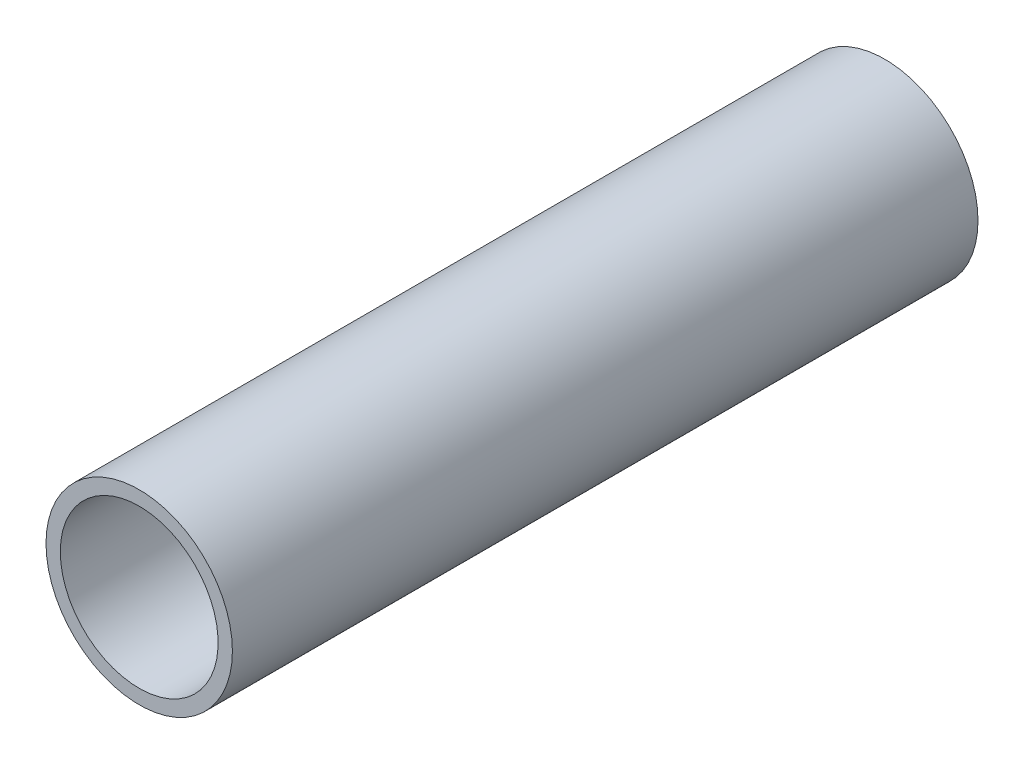
ISO-10303-21;
HEADER;
FILE_DESCRIPTION(('STEP AP214'),'2;1');
FILE_NAME('part.step','',(''),(''),'','','');
FILE_SCHEMA(('AUTOMOTIVE_DESIGN { 1 0 10303 214 1 1 1 1 }'));
ENDSEC;
DATA;
#1=APPLICATION_CONTEXT('core data for automotive mechanical design processes');
#2=APPLICATION_PROTOCOL_DEFINITION('international standard','automotive_design',2000,#1);
#3=PRODUCT_CONTEXT('',#1,'mechanical');
#4=PRODUCT('Part','Part','',(#3));
#5=PRODUCT_RELATED_PRODUCT_CATEGORY('part','',(#4));
#6=PRODUCT_DEFINITION_FORMATION('','',#4);
#7=PRODUCT_DEFINITION_CONTEXT('part definition',#1,'design');
#8=PRODUCT_DEFINITION('design','',#6,#7);
#9=PRODUCT_DEFINITION_SHAPE('','',#8);
#10=(LENGTH_UNIT() NAMED_UNIT(*) SI_UNIT(.MILLI.,.METRE.));
#11=(NAMED_UNIT(*) PLANE_ANGLE_UNIT() SI_UNIT($,.RADIAN.));
#12=(NAMED_UNIT(*) SI_UNIT($,.STERADIAN.) SOLID_ANGLE_UNIT());
#13=UNCERTAINTY_MEASURE_WITH_UNIT(LENGTH_MEASURE(1.E-05),#10,'distance_accuracy_value','');
#14=(GEOMETRIC_REPRESENTATION_CONTEXT(3) GLOBAL_UNCERTAINTY_ASSIGNED_CONTEXT((#13)) GLOBAL_UNIT_ASSIGNED_CONTEXT((#10,
#11,#12)) REPRESENTATION_CONTEXT('',''));
#15=CARTESIAN_POINT('',(0.,0.,0.));
#16=DIRECTION('',(0.,0.,1.));
#17=DIRECTION('',(1.,0.,0.));
#18=AXIS2_PLACEMENT_3D('',#15,#16,#17);
#19=CARTESIAN_POINT('',(0.,0.,152.4));
#20=DIRECTION('',(0.,0.,1.));
#21=DIRECTION('',(1.,0.,0.));
#22=AXIS2_PLACEMENT_3D('',#19,#20,#21);
#23=PLANE('',#22);
#24=CARTESIAN_POINT('',(0.,0.,152.4));
#25=DIRECTION('',(0.,0.,1.));
#26=DIRECTION('',(1.,0.,0.));
#27=AXIS2_PLACEMENT_3D('',#24,#25,#26);
#28=CIRCLE('',#27,19.05);
#29=CARTESIAN_POINT('',(-19.05,0.,152.4));
#30=VERTEX_POINT('',#29);
#31=EDGE_CURVE('E10',#30,#30,#28,.T.);
#32=ORIENTED_EDGE('',*,*,#31,.T.);
#33=EDGE_LOOP('',(#32));
#34=FACE_BOUND('',#33,.T.);
#35=CARTESIAN_POINT('',(0.,0.,152.4));
#36=DIRECTION('',(0.,0.,1.));
#37=DIRECTION('',(1.,0.,0.));
#38=AXIS2_PLACEMENT_3D('',#35,#36,#37);
#39=CIRCLE('',#38,16.129);
#40=CARTESIAN_POINT('',(-16.129,0.,152.4));
#41=VERTEX_POINT('',#40);
#42=EDGE_CURVE('E49',#41,#41,#39,.T.);
#43=ORIENTED_EDGE('',*,*,#42,.F.);
#44=EDGE_LOOP('',(#43));
#45=FACE_BOUND('',#44,.T.);
#46=ADVANCED_FACE('F35',(#34,#45),#23,.T.);
#47=CARTESIAN_POINT('',(0.,0.,0.));
#48=DIRECTION('',(0.,0.,1.));
#49=DIRECTION('',(1.,0.,0.));
#50=AXIS2_PLACEMENT_3D('',#47,#48,#49);
#51=PLANE('',#50);
#52=CARTESIAN_POINT('',(0.,0.,0.));
#53=DIRECTION('',(0.,0.,1.));
#54=DIRECTION('',(1.,0.,0.));
#55=AXIS2_PLACEMENT_3D('',#52,#53,#54);
#56=CIRCLE('',#55,19.05);
#57=CARTESIAN_POINT('',(-19.05,0.,0.));
#58=VERTEX_POINT('',#57);
#59=EDGE_CURVE('E39',#58,#58,#56,.T.);
#60=ORIENTED_EDGE('',*,*,#59,.F.);
#61=EDGE_LOOP('',(#60));
#62=FACE_BOUND('',#61,.T.);
#63=CARTESIAN_POINT('',(0.,0.,0.));
#64=DIRECTION('',(0.,0.,1.));
#65=DIRECTION('',(1.,0.,0.));
#66=AXIS2_PLACEMENT_3D('',#63,#64,#65);
#67=CIRCLE('',#66,16.129);
#68=CARTESIAN_POINT('',(-16.129,0.,0.));
#69=VERTEX_POINT('',#68);
#70=EDGE_CURVE('E51',#69,#69,#67,.T.);
#71=ORIENTED_EDGE('',*,*,#70,.T.);
#72=EDGE_LOOP('',(#71));
#73=FACE_BOUND('',#72,.T.);
#74=ADVANCED_FACE('F62',(#62,#73),#51,.F.);
#75=CARTESIAN_POINT('',(0.,0.,152.4));
#76=DIRECTION('',(0.,0.,-1.));
#77=DIRECTION('',(-1.,0.,0.));
#78=AXIS2_PLACEMENT_3D('',#75,#76,#77);
#79=CYLINDRICAL_SURFACE('',#78,19.05);
#80=CARTESIAN_POINT('',(-19.05,0.,152.4));
#81=CARTESIAN_POINT('',(-19.05,0.,150.8125));
#82=CARTESIAN_POINT('',(-19.05,0.,149.225));
#83=CARTESIAN_POINT('',(-19.05,0.,146.05));
#84=CARTESIAN_POINT('',(-19.05,0.,144.4625));
#85=CARTESIAN_POINT('',(-19.05,0.,141.2875));
#86=CARTESIAN_POINT('',(-19.05,0.,139.7));
#87=CARTESIAN_POINT('',(-19.05,0.,136.525));
#88=CARTESIAN_POINT('',(-19.05,0.,134.9375));
#89=CARTESIAN_POINT('',(-19.05,0.,131.7625));
#90=CARTESIAN_POINT('',(-19.05,0.,130.175));
#91=CARTESIAN_POINT('',(-19.05,0.,127.));
#92=CARTESIAN_POINT('',(-19.05,0.,125.4125));
#93=CARTESIAN_POINT('',(-19.05,0.,122.2375));
#94=CARTESIAN_POINT('',(-19.05,0.,120.65));
#95=CARTESIAN_POINT('',(-19.05,0.,117.475));
#96=CARTESIAN_POINT('',(-19.05,0.,115.8875));
#97=CARTESIAN_POINT('',(-19.05,0.,112.7125));
#98=CARTESIAN_POINT('',(-19.05,0.,111.125));
#99=CARTESIAN_POINT('',(-19.05,0.,107.95));
#100=CARTESIAN_POINT('',(-19.05,0.,106.3625));
#101=CARTESIAN_POINT('',(-19.05,0.,103.1875));
#102=CARTESIAN_POINT('',(-19.05,0.,101.6));
#103=CARTESIAN_POINT('',(-19.05,0.,98.425));
#104=CARTESIAN_POINT('',(-19.05,0.,96.8375));
#105=CARTESIAN_POINT('',(-19.05,0.,93.6625));
#106=CARTESIAN_POINT('',(-19.05,0.,92.075));
#107=CARTESIAN_POINT('',(-19.05,0.,88.9));
#108=CARTESIAN_POINT('',(-19.05,0.,87.3125));
#109=CARTESIAN_POINT('',(-19.05,0.,84.1375));
#110=CARTESIAN_POINT('',(-19.05,0.,82.55));
#111=CARTESIAN_POINT('',(-19.05,0.,79.375));
#112=CARTESIAN_POINT('',(-19.05,0.,77.7875));
#113=CARTESIAN_POINT('',(-19.05,0.,74.6125));
#114=CARTESIAN_POINT('',(-19.05,0.,73.025));
#115=CARTESIAN_POINT('',(-19.05,0.,69.85));
#116=CARTESIAN_POINT('',(-19.05,0.,68.2625));
#117=CARTESIAN_POINT('',(-19.05,0.,65.0875));
#118=CARTESIAN_POINT('',(-19.05,0.,63.5));
#119=CARTESIAN_POINT('',(-19.05,0.,60.325));
#120=CARTESIAN_POINT('',(-19.05,0.,58.7375));
#121=CARTESIAN_POINT('',(-19.05,0.,55.5625));
#122=CARTESIAN_POINT('',(-19.05,0.,53.975));
#123=CARTESIAN_POINT('',(-19.05,0.,50.8));
#124=CARTESIAN_POINT('',(-19.05,0.,49.2125));
#125=CARTESIAN_POINT('',(-19.05,0.,46.0375));
#126=CARTESIAN_POINT('',(-19.05,0.,44.45));
#127=CARTESIAN_POINT('',(-19.05,0.,41.275));
#128=CARTESIAN_POINT('',(-19.05,0.,39.6875));
#129=CARTESIAN_POINT('',(-19.05,0.,36.5125));
#130=CARTESIAN_POINT('',(-19.05,0.,34.925));
#131=CARTESIAN_POINT('',(-19.05,0.,31.75));
#132=CARTESIAN_POINT('',(-19.05,0.,30.1625));
#133=CARTESIAN_POINT('',(-19.05,0.,26.9875));
#134=CARTESIAN_POINT('',(-19.05,0.,25.4));
#135=CARTESIAN_POINT('',(-19.05,0.,22.225));
#136=CARTESIAN_POINT('',(-19.05,0.,20.6375));
#137=CARTESIAN_POINT('',(-19.05,0.,17.4625));
#138=CARTESIAN_POINT('',(-19.05,0.,15.875));
#139=CARTESIAN_POINT('',(-19.05,0.,12.7));
#140=CARTESIAN_POINT('',(-19.05,0.,11.1125));
#141=CARTESIAN_POINT('',(-19.05,0.,7.93750000000001));
#142=CARTESIAN_POINT('',(-19.05,0.,6.35));
#143=CARTESIAN_POINT('',(-19.05,0.,3.175));
#144=CARTESIAN_POINT('',(-19.05,0.,1.5875));
#145=CARTESIAN_POINT('',(-19.05,0.,0.));
#146=B_SPLINE_CURVE_WITH_KNOTS('',3,(#80,#81,#82,#83,#84,#85,#86,#87,#88,#89,#90,#91,#92,#93,
#94,#95,#96,#97,#98,#99,#100,#101,#102,#103,#104,#105,#106,#107,#108,#109,#110,#111,#112,#113,
#114,#115,#116,#117,#118,#119,#120,#121,#122,#123,#124,#125,#126,#127,#128,#129,#130,#131,#132,
#133,#134,#135,#136,#137,#138,#139,#140,#141,#142,#143,#144,#145),.UNSPECIFIED.,.F.,.F.,(4,2,2,
2,2,2,2,2,2,2,2,2,2,2,2,2,2,2,2,2,2,2,2,2,2,2,2,2,2,2,2,2,4),(0.,4.7625,9.52500000000001,
14.2875,19.05,23.8125,28.575,33.3375,38.1,42.8625,47.625,52.3875,57.15,61.9125,66.675,71.4375,
76.2,80.9625,85.725,90.4875,95.25,100.0125,104.775,109.5375,114.3,119.0625,123.825,128.5875,
133.35,138.1125,142.875,147.6375,152.4),.UNSPECIFIED.);
#147=EDGE_CURVE('BSEAM37',#30,#58,#146,.T.);
#148=ORIENTED_EDGE('',*,*,#31,.F.);
#149=ORIENTED_EDGE('',*,*,#59,.T.);
#150=ORIENTED_EDGE('',*,*,#147,.T.);
#151=ORIENTED_EDGE('',*,*,#147,.F.);
#152=EDGE_LOOP('',(#148,#150,#149,#151));
#153=FACE_BOUND('',#152,.T.);
#154=ADVANCED_FACE('F37',(#153),#79,.T.);
#155=CARTESIAN_POINT('',(0.,0.,152.4));
#156=DIRECTION('',(0.,0.,-1.));
#157=DIRECTION('',(-1.,0.,0.));
#158=AXIS2_PLACEMENT_3D('',#155,#156,#157);
#159=CYLINDRICAL_SURFACE('',#158,16.129);
#160=CARTESIAN_POINT('',(-16.129,0.,152.4));
#161=CARTESIAN_POINT('',(-16.129,0.,150.8125));
#162=CARTESIAN_POINT('',(-16.129,0.,149.225));
#163=CARTESIAN_POINT('',(-16.129,0.,146.05));
#164=CARTESIAN_POINT('',(-16.129,0.,144.4625));
#165=CARTESIAN_POINT('',(-16.129,0.,141.2875));
#166=CARTESIAN_POINT('',(-16.129,0.,139.7));
#167=CARTESIAN_POINT('',(-16.129,0.,136.525));
#168=CARTESIAN_POINT('',(-16.129,0.,134.9375));
#169=CARTESIAN_POINT('',(-16.129,0.,131.7625));
#170=CARTESIAN_POINT('',(-16.129,0.,130.175));
#171=CARTESIAN_POINT('',(-16.129,0.,127.));
#172=CARTESIAN_POINT('',(-16.129,0.,125.4125));
#173=CARTESIAN_POINT('',(-16.129,0.,122.2375));
#174=CARTESIAN_POINT('',(-16.129,0.,120.65));
#175=CARTESIAN_POINT('',(-16.129,0.,117.475));
#176=CARTESIAN_POINT('',(-16.129,0.,115.8875));
#177=CARTESIAN_POINT('',(-16.129,0.,112.7125));
#178=CARTESIAN_POINT('',(-16.129,0.,111.125));
#179=CARTESIAN_POINT('',(-16.129,0.,107.95));
#180=CARTESIAN_POINT('',(-16.129,0.,106.3625));
#181=CARTESIAN_POINT('',(-16.129,0.,103.1875));
#182=CARTESIAN_POINT('',(-16.129,0.,101.6));
#183=CARTESIAN_POINT('',(-16.129,0.,98.425));
#184=CARTESIAN_POINT('',(-16.129,0.,96.8375));
#185=CARTESIAN_POINT('',(-16.129,0.,93.6625));
#186=CARTESIAN_POINT('',(-16.129,0.,92.075));
#187=CARTESIAN_POINT('',(-16.129,0.,88.9));
#188=CARTESIAN_POINT('',(-16.129,0.,87.3125));
#189=CARTESIAN_POINT('',(-16.129,0.,84.1375));
#190=CARTESIAN_POINT('',(-16.129,0.,82.55));
#191=CARTESIAN_POINT('',(-16.129,0.,79.375));
#192=CARTESIAN_POINT('',(-16.129,0.,77.7875));
#193=CARTESIAN_POINT('',(-16.129,0.,74.6125));
#194=CARTESIAN_POINT('',(-16.129,0.,73.025));
#195=CARTESIAN_POINT('',(-16.129,0.,69.85));
#196=CARTESIAN_POINT('',(-16.129,0.,68.2625));
#197=CARTESIAN_POINT('',(-16.129,0.,65.0875));
#198=CARTESIAN_POINT('',(-16.129,0.,63.5));
#199=CARTESIAN_POINT('',(-16.129,0.,60.325));
#200=CARTESIAN_POINT('',(-16.129,0.,58.7375));
#201=CARTESIAN_POINT('',(-16.129,0.,55.5625));
#202=CARTESIAN_POINT('',(-16.129,0.,53.975));
#203=CARTESIAN_POINT('',(-16.129,0.,50.8));
#204=CARTESIAN_POINT('',(-16.129,0.,49.2125));
#205=CARTESIAN_POINT('',(-16.129,0.,46.0375));
#206=CARTESIAN_POINT('',(-16.129,0.,44.45));
#207=CARTESIAN_POINT('',(-16.129,0.,41.275));
#208=CARTESIAN_POINT('',(-16.129,0.,39.6875));
#209=CARTESIAN_POINT('',(-16.129,0.,36.5125));
#210=CARTESIAN_POINT('',(-16.129,0.,34.925));
#211=CARTESIAN_POINT('',(-16.129,0.,31.75));
#212=CARTESIAN_POINT('',(-16.129,0.,30.1625));
#213=CARTESIAN_POINT('',(-16.129,0.,26.9875));
#214=CARTESIAN_POINT('',(-16.129,0.,25.4));
#215=CARTESIAN_POINT('',(-16.129,0.,22.225));
#216=CARTESIAN_POINT('',(-16.129,0.,20.6375));
#217=CARTESIAN_POINT('',(-16.129,0.,17.4625));
#218=CARTESIAN_POINT('',(-16.129,0.,15.875));
#219=CARTESIAN_POINT('',(-16.129,0.,12.7));
#220=CARTESIAN_POINT('',(-16.129,0.,11.1125));
#221=CARTESIAN_POINT('',(-16.129,0.,7.93750000000001));
#222=CARTESIAN_POINT('',(-16.129,0.,6.35));
#223=CARTESIAN_POINT('',(-16.129,0.,3.175));
#224=CARTESIAN_POINT('',(-16.129,0.,1.5875));
#225=CARTESIAN_POINT('',(-16.129,0.,0.));
#226=B_SPLINE_CURVE_WITH_KNOTS('',3,(#160,#161,#162,#163,#164,#165,#166,#167,#168,#169,#170,
#171,#172,#173,#174,#175,#176,#177,#178,#179,#180,#181,#182,#183,#184,#185,#186,#187,#188,#189,
#190,#191,#192,#193,#194,#195,#196,#197,#198,#199,#200,#201,#202,#203,#204,#205,#206,#207,#208,
#209,#210,#211,#212,#213,#214,#215,#216,#217,#218,#219,#220,#221,#222,#223,#224,#225),
.UNSPECIFIED.,.F.,.F.,(4,2,2,2,2,2,2,2,2,2,2,2,2,2,2,2,2,2,2,2,2,2,2,2,2,2,2,2,2,2,2,2,4),(0.,
4.76249999999998,9.52499999999998,14.2875,19.05,23.8125,28.575,33.3375,38.1,42.8625,47.625,
52.3875,57.15,61.9125,66.675,71.4375,76.2,80.9625,85.725,90.4875,95.25,100.0125,104.775,
109.5375,114.3,119.0625,123.825,128.5875,133.35,138.1125,142.875,147.6375,152.4),.UNSPECIFIED.);
#227=EDGE_CURVE('BSEAM58',#41,#69,#226,.T.);
#228=ORIENTED_EDGE('',*,*,#42,.T.);
#229=ORIENTED_EDGE('',*,*,#70,.F.);
#230=ORIENTED_EDGE('',*,*,#227,.T.);
#231=ORIENTED_EDGE('',*,*,#227,.F.);
#232=EDGE_LOOP('',(#228,#230,#229,#231));
#233=FACE_BOUND('',#232,.T.);
#234=ADVANCED_FACE('F58',(#233),#159,.F.);
#235=CLOSED_SHELL('',(#46,#74,#154,#234));
#236=MANIFOLD_SOLID_BREP('B2',#235);
#237=ADVANCED_BREP_SHAPE_REPRESENTATION('',(#18,#236),#14);
#238=SHAPE_DEFINITION_REPRESENTATION(#9,#237);
ENDSEC;
END-ISO-10303-21;
